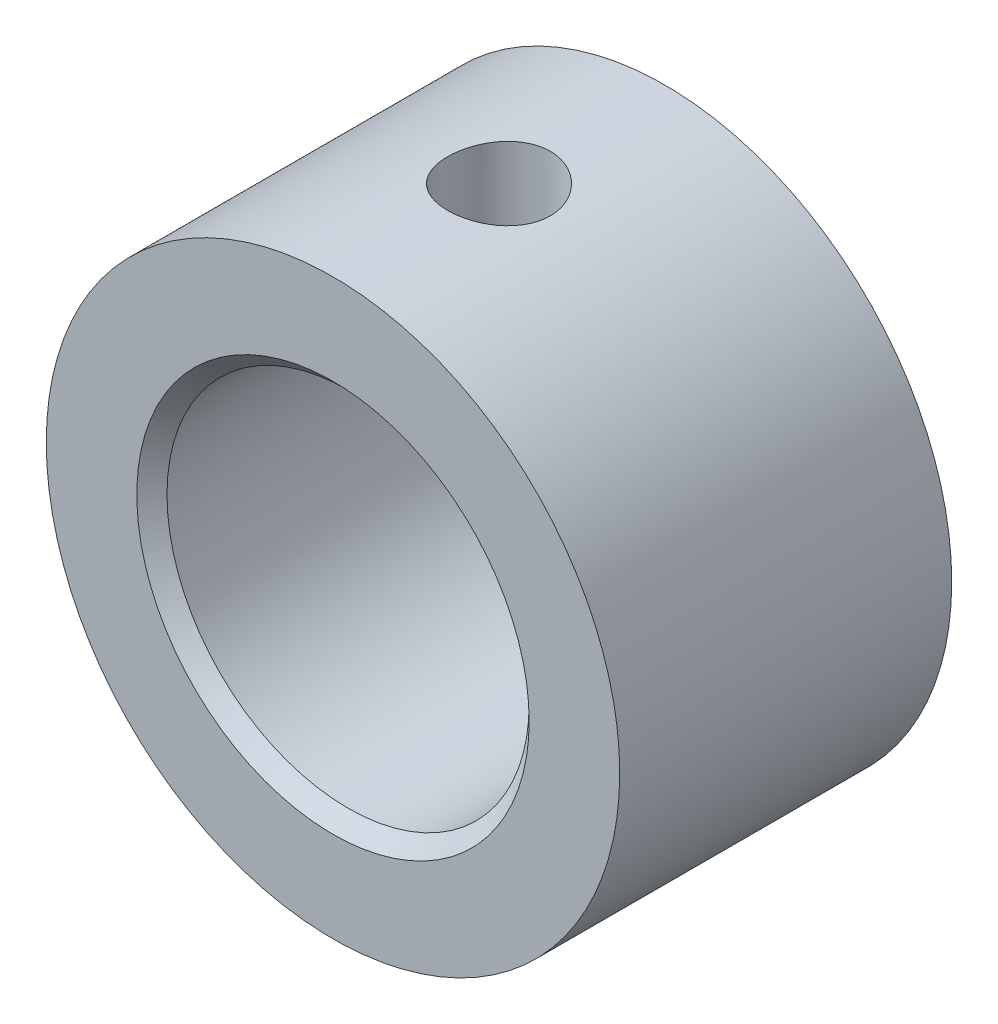
ISO-10303-21;
HEADER;
FILE_DESCRIPTION(('STEP AP214'),'2;1');
FILE_NAME('part.step','',(''),(''),'','','');
FILE_SCHEMA(('AUTOMOTIVE_DESIGN { 1 0 10303 214 1 1 1 1 }'));
ENDSEC;
DATA;
#1=APPLICATION_CONTEXT('core data for automotive mechanical design processes');
#2=APPLICATION_PROTOCOL_DEFINITION('international standard','automotive_design',2000,#1);
#3=PRODUCT_CONTEXT('',#1,'mechanical');
#4=PRODUCT('Part','Part','',(#3));
#5=PRODUCT_RELATED_PRODUCT_CATEGORY('part','',(#4));
#6=PRODUCT_DEFINITION_FORMATION('','',#4);
#7=PRODUCT_DEFINITION_CONTEXT('part definition',#1,'design');
#8=PRODUCT_DEFINITION('design','',#6,#7);
#9=PRODUCT_DEFINITION_SHAPE('','',#8);
#10=(LENGTH_UNIT() NAMED_UNIT(*) SI_UNIT(.MILLI.,.METRE.));
#11=(NAMED_UNIT(*) PLANE_ANGLE_UNIT() SI_UNIT($,.RADIAN.));
#12=(NAMED_UNIT(*) SI_UNIT($,.STERADIAN.) SOLID_ANGLE_UNIT());
#13=UNCERTAINTY_MEASURE_WITH_UNIT(LENGTH_MEASURE(1.E-05),#10,'distance_accuracy_value','');
#14=(GEOMETRIC_REPRESENTATION_CONTEXT(3) GLOBAL_UNCERTAINTY_ASSIGNED_CONTEXT((#13)) GLOBAL_UNIT_ASSIGNED_CONTEXT((#10,
#11,#12)) REPRESENTATION_CONTEXT('',''));
#15=CARTESIAN_POINT('',(0.,0.,0.));
#16=DIRECTION('',(0.,0.,1.));
#17=DIRECTION('',(1.,0.,0.));
#18=AXIS2_PLACEMENT_3D('',#15,#16,#17);
#19=CARTESIAN_POINT('',(0.,0.,11.));
#20=DIRECTION('',(0.,0.,1.));
#21=DIRECTION('',(1.,0.,0.));
#22=AXIS2_PLACEMENT_3D('',#19,#20,#21);
#23=PLANE('',#22);
#24=CARTESIAN_POINT('',(0.,0.,11.));
#25=DIRECTION('',(0.,0.,1.));
#26=DIRECTION('',(1.,0.,0.));
#27=AXIS2_PLACEMENT_3D('',#24,#25,#26);
#28=CIRCLE('',#27,13.);
#29=CARTESIAN_POINT('',(13.,0.,11.));
#30=VERTEX_POINT('',#29);
#31=EDGE_CURVE('E63',#30,#30,#28,.F.);
#32=ORIENTED_EDGE('',*,*,#31,.T.);
#33=EDGE_LOOP('',(#32));
#34=FACE_BOUND('',#33,.T.);
#35=CARTESIAN_POINT('',(0.,0.,11.));
#36=DIRECTION('',(0.,0.,1.));
#37=DIRECTION('',(1.,0.,0.));
#38=AXIS2_PLACEMENT_3D('',#35,#36,#37);
#39=CIRCLE('',#38,19.);
#40=CARTESIAN_POINT('',(19.,0.,11.));
#41=VERTEX_POINT('',#40);
#42=EDGE_CURVE('E83',#41,#41,#39,.T.);
#43=ORIENTED_EDGE('',*,*,#42,.T.);
#44=EDGE_LOOP('',(#43));
#45=FACE_BOUND('',#44,.T.);
#46=ADVANCED_FACE('F49',(#34,#45),#23,.T.);
#47=CARTESIAN_POINT('',(0.,0.,-11.));
#48=DIRECTION('',(0.,0.,1.));
#49=DIRECTION('',(1.,0.,0.));
#50=AXIS2_PLACEMENT_3D('',#47,#48,#49);
#51=PLANE('',#50);
#52=CARTESIAN_POINT('',(0.,0.,-11.));
#53=DIRECTION('',(0.,0.,1.));
#54=DIRECTION('',(1.,0.,0.));
#55=AXIS2_PLACEMENT_3D('',#52,#53,#54);
#56=CIRCLE('',#55,13.);
#57=CARTESIAN_POINT('',(13.,0.,-11.));
#58=VERTEX_POINT('',#57);
#59=EDGE_CURVE('E79',#58,#58,#56,.T.);
#60=ORIENTED_EDGE('',*,*,#59,.T.);
#61=EDGE_LOOP('',(#60));
#62=FACE_BOUND('',#61,.T.);
#63=CARTESIAN_POINT('',(0.,0.,-11.));
#64=DIRECTION('',(0.,0.,1.));
#65=DIRECTION('',(1.,0.,0.));
#66=AXIS2_PLACEMENT_3D('',#63,#64,#65);
#67=CIRCLE('',#66,19.);
#68=CARTESIAN_POINT('',(19.,0.,-11.));
#69=VERTEX_POINT('',#68);
#70=EDGE_CURVE('E84',#69,#69,#67,.T.);
#71=ORIENTED_EDGE('',*,*,#70,.F.);
#72=EDGE_LOOP('',(#71));
#73=FACE_BOUND('',#72,.T.);
#74=ADVANCED_FACE('F114',(#62,#73),#51,.F.);
#75=CARTESIAN_POINT('',(0.,0.,11.));
#76=DIRECTION('',(0.,0.,-1.));
#77=DIRECTION('',(-1.,0.,0.));
#78=AXIS2_PLACEMENT_3D('',#75,#76,#77);
#79=CYLINDRICAL_SURFACE('',#78,19.);
#80=CARTESIAN_POINT('',(0.,19.,-3.39999999999999));
#81=CARTESIAN_POINT('',(0.189359116148753,18.9999966349209,-3.39999260489716));
#82=CARTESIAN_POINT('',(0.378816292653439,18.99713985582,-3.38412733886621));
#83=CARTESIAN_POINT('',(0.752402493709805,18.9860188360453,-3.3211201690908));
#84=CARTESIAN_POINT('',(0.936526702895268,18.9777498582218,-3.27395086527263));
#85=CARTESIAN_POINT('',(1.29398914244799,18.9567304870848,-3.14981742951105));
#86=CARTESIAN_POINT('',(1.46733657564912,18.9439839809906,-3.07287913600945));
#87=CARTESIAN_POINT('',(1.79864358139372,18.9154055229009,-2.89146270633255));
#88=CARTESIAN_POINT('',(1.95660461419851,18.8995738641336,-2.78698718709902));
#89=CARTESIAN_POINT('',(2.25440369777336,18.8663818606133,-2.55224612642311));
#90=CARTESIAN_POINT('',(2.39404879462585,18.8490080449846,-2.42173767731485));
#91=CARTESIAN_POINT('',(2.64958378977429,18.8147911577378,-2.13915810684836));
#92=CARTESIAN_POINT('',(2.76547207227252,18.797948122286,-1.98708552001449));
#93=CARTESIAN_POINT('',(2.97099402925277,18.7665691484542,-1.66434686349449));
#94=CARTESIAN_POINT('',(3.06043372862367,18.7520505970165,-1.49355543055129));
#95=CARTESIAN_POINT('',(3.20927847227692,18.7271530893692,-1.13906853026264));
#96=CARTESIAN_POINT('',(3.26868586635062,18.7167738093077,-0.95537407375846));
#97=CARTESIAN_POINT('',(3.3551651248459,18.7014650301702,-0.582352232651503));
#98=CARTESIAN_POINT('',(3.38257209811783,18.6964790933344,-0.393104898969889));
#99=CARTESIAN_POINT('',(3.40531220803424,18.69235114719,-0.0126371955222291));
#100=CARTESIAN_POINT('',(3.40064796223401,18.6932086609569,0.17858301195192));
#101=CARTESIAN_POINT('',(3.35965028298723,18.7006192804987,0.555155821151376));
#102=CARTESIAN_POINT('',(3.32369593703935,18.7071042060553,0.740551233006275));
#103=CARTESIAN_POINT('',(3.22173478934299,18.7249320285173,1.10263530298788));
#104=CARTESIAN_POINT('',(3.15572681435812,18.7362751150751,1.27932362090778));
#105=CARTESIAN_POINT('',(2.99515565509624,18.7626134640921,1.62009803570002));
#106=CARTESIAN_POINT('',(2.90043756235276,18.7776284515749,1.7841095531177));
#107=CARTESIAN_POINT('',(2.68524459961301,18.8096054823071,2.09405428906096));
#108=CARTESIAN_POINT('',(2.56476734176921,18.8265677059959,2.23998582960949));
#109=CARTESIAN_POINT('',(2.29942291648305,18.8608261487862,2.51182017623147));
#110=CARTESIAN_POINT('',(2.15423106891539,18.8781236715029,2.63740610472903));
#111=CARTESIAN_POINT('',(1.8446702868463,18.9108798607181,2.8624837075214));
#112=CARTESIAN_POINT('',(1.6803011911899,18.9263385117616,2.9619751625099));
#113=CARTESIAN_POINT('',(1.33673505364186,18.9537023046531,3.13207868765565));
#114=CARTESIAN_POINT('',(1.15752241699952,18.9656036471012,3.20265990968225));
#115=CARTESIAN_POINT('',(0.789525108664181,18.9844820701314,3.31263025533811));
#116=CARTESIAN_POINT('',(0.600741363711164,18.9914596264956,3.35202239279308));
#117=CARTESIAN_POINT('',(0.221689022440056,18.9996395277903,3.39806019315269));
#118=CARTESIAN_POINT('',(0.0314747990638452,19.0009184998551,3.40514037678198));
#119=CARTESIAN_POINT('',(-0.347420440928694,18.9977680347034,3.38751583059651));
#120=CARTESIAN_POINT('',(-0.536101525527205,18.9933388520024,3.36281251794565));
#121=CARTESIAN_POINT('',(-0.905211583009181,18.9793173345974,3.28268356805853));
#122=CARTESIAN_POINT('',(-1.08568936212386,18.9697616265791,3.22747578861996));
#123=CARTESIAN_POINT('',(-1.43482762283372,18.9465540454197,3.08813931438424));
#124=CARTESIAN_POINT('',(-1.60348735836489,18.9329019139614,3.00400879569343));
#125=CARTESIAN_POINT('',(-1.92607037485075,18.9028249257681,2.80823911565088));
#126=CARTESIAN_POINT('',(-2.07982847751297,18.8863735762729,2.69633193020073));
#127=CARTESIAN_POINT('',(-2.36653881416634,18.852595910538,2.44855076121745));
#128=CARTESIAN_POINT('',(-2.49948928804732,18.8352695204427,2.31267475223546));
#129=CARTESIAN_POINT('',(-2.74244444474001,18.8014430595408,2.01885336372394));
#130=CARTESIAN_POINT('',(-2.85215381250747,18.78495543858,1.86066212754368));
#131=CARTESIAN_POINT('',(-3.04344209969357,18.7549160166177,1.52784032049266));
#132=CARTESIAN_POINT('',(-3.12502200376045,18.7413641128602,1.35321032531928));
#133=CARTESIAN_POINT('',(-3.25730709364541,18.7188264245687,0.993250009811813));
#134=CARTESIAN_POINT('',(-3.30815255943243,18.7098199252254,0.807972598993068));
#135=CARTESIAN_POINT('',(-3.37796206615852,18.6973434437131,0.431330114277985));
#136=CARTESIAN_POINT('',(-3.39692934938192,18.6938728984918,0.239965661503487));
#137=CARTESIAN_POINT('',(-3.40234319134434,18.6928880346328,-0.140464751160433));
#138=CARTESIAN_POINT('',(-3.38925512617539,18.6952884808671,-0.329524026264392));
#139=CARTESIAN_POINT('',(-3.3319433273961,18.7055870627166,-0.702702377064291));
#140=CARTESIAN_POINT('',(-3.28771974175138,18.7134851722051,-0.886821476233157));
#141=CARTESIAN_POINT('',(-3.16958106311172,18.7338547388841,-1.24467245641459));
#142=CARTESIAN_POINT('',(-3.09571200330978,18.746319103037,-1.41841996403912));
#143=CARTESIAN_POINT('',(-2.92042873118774,18.7744225034866,-1.75113058193775));
#144=CARTESIAN_POINT('',(-2.8190128153699,18.7900617361021,-1.91009277707165));
#145=CARTESIAN_POINT('',(-2.58987842643081,18.8230197247812,-2.21106023020039));
#146=CARTESIAN_POINT('',(-2.46181965856844,18.8403585009623,-2.35280426215342));
#147=CARTESIAN_POINT('',(-2.1837480840731,18.8746080286539,-2.61294848534312));
#148=CARTESIAN_POINT('',(-2.03373023484455,18.8915186808027,-2.73134330006126));
#149=CARTESIAN_POINT('',(-1.71454851307093,18.9231663993433,-2.94231591812969));
#150=CARTESIAN_POINT('',(-1.54523951687639,18.9378847672342,-3.03467702903229));
#151=CARTESIAN_POINT('',(-1.19330528614379,18.9633074648247,-3.1894994199818));
#152=CARTESIAN_POINT('',(-1.01069307810336,18.9740156598171,-3.25198950801308));
#153=CARTESIAN_POINT('',(-0.68955673562887,18.9879627193211,-3.33223394210692));
#154=CARTESIAN_POINT('',(-0.552939078666318,18.992451791999,-3.35760395909225));
#155=CARTESIAN_POINT('',(-0.277565147922436,18.998471633606,-3.39148951556511));
#156=CARTESIAN_POINT('',(-0.13880892063465,19.0000024667574,-3.40000542094968));
#157=CARTESIAN_POINT('',(0.,19.,-3.39999999999999));
#158=B_SPLINE_CURVE_WITH_KNOTS('',3,(#80,#81,#82,#83,#84,#85,#86,#87,#88,#89,#90,#91,#92,#93,
#94,#95,#96,#97,#98,#99,#100,#101,#102,#103,#104,#105,#106,#107,#108,#109,#110,#111,#112,#113,
#114,#115,#116,#117,#118,#119,#120,#121,#122,#123,#124,#125,#126,#127,#128,#129,#130,#131,#132,
#133,#134,#135,#136,#137,#138,#139,#140,#141,#142,#143,#144,#145,#146,#147,#148,#149,#150,#151,
#152,#153,#154,#155,#156,#157),.UNSPECIFIED.,.T.,.F.,(4,2,2,2,2,2,2,2,2,2,2,2,2,2,2,2,2,2,2,2,2,
2,2,2,2,2,2,2,2,2,2,2,2,2,2,2,2,2,4),(0.,0.567569821708364,1.13563708729388,1.70321239244777,
2.27073377872327,2.84382163815749,3.41694846270903,3.99417992316398,4.57136621281048,
5.1424523938897,5.71349196520635,6.27770806931201,6.84194620122778,7.4092846332032,
7.97667567967407,8.55219507118144,9.12771929938311,9.70385604029427,10.2799371018632,
10.8482479323349,11.4165334238169,11.9808118150049,12.5451257966195,13.1151124371865,
13.6851472666984,14.2620404102666,14.8389133581249,15.4131330256255,15.9872942865302,
16.5531694756567,17.1190419755876,17.6840391733022,18.2490713184047,18.8218200155169,
19.3947004432856,19.9722172111757,20.5491758853879,20.9652396396078,21.3812943611256),.UNSPECIFIED.);
#159=CARTESIAN_POINT('',(0.,19.,-3.39999999999999));
#160=VERTEX_POINT('',#159);
#161=EDGE_CURVE('E10',#160,#160,#158,.T.);
#162=ORIENTED_EDGE('',*,*,#161,.T.);
#163=EDGE_LOOP('',(#162));
#164=FACE_BOUND('',#163,.T.);
#165=ORIENTED_EDGE('',*,*,#42,.F.);
#166=EDGE_LOOP('',(#165));
#167=FACE_BOUND('',#166,.T.);
#168=ORIENTED_EDGE('',*,*,#70,.T.);
#169=EDGE_LOOP('',(#168));
#170=FACE_BOUND('',#169,.T.);
#171=ADVANCED_FACE('F118',(#164,#167,#170),#79,.T.);
#172=CARTESIAN_POINT('',(0.,0.,11.));
#173=DIRECTION('',(0.,0.,-1.));
#174=DIRECTION('',(-1.,0.,0.));
#175=AXIS2_PLACEMENT_3D('',#172,#173,#174);
#176=CYLINDRICAL_SURFACE('',#175,12.);
#177=CARTESIAN_POINT('',(0.,12.,-3.39999999999999));
#178=CARTESIAN_POINT('',(0.186988723006802,11.9999976894995,-3.39999654515311));
#179=CARTESIAN_POINT('',(0.374013129044811,11.9955869790957,-3.38452289452517));
#180=CARTESIAN_POINT('',(0.742645539803736,11.978421310291,-3.32316474263533));
#181=CARTESIAN_POINT('',(0.924251394649756,11.9656630847614,-3.27726833413674));
#182=CARTESIAN_POINT('',(1.27667451033523,11.9332056155741,-3.15669818854128));
#183=CARTESIAN_POINT('',(1.44750629175166,11.9135159600134,-3.08206419022341));
#184=CARTESIAN_POINT('',(1.77422996762131,11.8692596451322,-2.90629246901087));
#185=CARTESIAN_POINT('',(1.93012036783267,11.8446924987819,-2.80515209906423));
#186=CARTESIAN_POINT('',(2.2265727408465,11.7926067463956,-2.57647599407728));
#187=CARTESIAN_POINT('',(2.36669287477965,11.7650327041957,-2.44838010217978));
#188=CARTESIAN_POINT('',(2.62377746294635,11.710384349036,-2.17062474848013));
#189=CARTESIAN_POINT('',(2.74073851104081,11.6833101101154,-2.02096212031917));
#190=CARTESIAN_POINT('',(2.9504214791365,11.6321505087001,-1.70069227595643));
#191=CARTESIAN_POINT('',(3.04262008737009,11.6081345918898,-1.52973032035533));
#192=CARTESIAN_POINT('',(3.19678447976278,11.5666325199825,-1.17393952935456));
#193=CARTESIAN_POINT('',(3.25875664675473,11.5491449864884,-0.989113631084229));
#194=CARTESIAN_POINT('',(3.3491458454404,11.523254649818,-0.615769196133596));
#195=CARTESIAN_POINT('',(3.3783706746558,11.5146335954139,-0.427461754396682));
#196=CARTESIAN_POINT('',(3.40495614059056,11.5068015751047,-0.0484345834704532));
#197=CARTESIAN_POINT('',(3.40232357417,11.5075886019598,0.142284622488662));
#198=CARTESIAN_POINT('',(3.3659069468269,11.5182894019548,0.514290642327089));
#199=CARTESIAN_POINT('',(3.33311680165041,11.5279119623157,0.695684488524945));
#200=CARTESIAN_POINT('',(3.23891447064178,11.5547309762144,1.05028371210905));
#201=CARTESIAN_POINT('',(3.17749973577107,11.571928104265,1.22348835872839));
#202=CARTESIAN_POINT('',(3.02702000247794,11.6122029970937,1.55930523930796));
#203=CARTESIAN_POINT('',(2.93761936103543,11.6353515015401,1.7217582272462));
#204=CARTESIAN_POINT('',(2.73393923873161,11.6848848404208,2.02969789754663));
#205=CARTESIAN_POINT('',(2.61965430037688,11.7112703842306,2.17518084736347));
#206=CARTESIAN_POINT('',(2.3644384880438,11.7655019418414,2.45070988855651));
#207=CARTESIAN_POINT('',(2.22267761473758,11.7933658561595,2.57998484905875));
#208=CARTESIAN_POINT('',(1.91914394226504,11.8465434962535,2.8130953645113));
#209=CARTESIAN_POINT('',(1.75737014055516,11.8718570941566,2.91692964423866));
#210=CARTESIAN_POINT('',(1.41710818718241,11.9172725195752,3.09661243148349));
#211=CARTESIAN_POINT('',(1.23853415181858,11.9373453394433,3.17230611971877));
#212=CARTESIAN_POINT('',(0.870493313262321,11.9698084682665,3.29236735714387));
#213=CARTESIAN_POINT('',(0.681029221017462,11.9822006802423,3.33674266645245));
#214=CARTESIAN_POINT('',(0.303154957557575,11.9976120721705,3.3916613378015));
#215=CARTESIAN_POINT('',(0.11490850759277,12.0009211466434,3.40325144365154));
#216=CARTESIAN_POINT('',(-0.260843954691256,11.9986351585894,3.3951824088832));
#217=CARTESIAN_POINT('',(-0.44835005164439,11.9930411452132,3.37552695028075));
#218=CARTESIAN_POINT('',(-0.813458754633998,11.9737661190198,3.30637784818576));
#219=CARTESIAN_POINT('',(-0.991183847873728,11.9602471142118,3.25748157277704));
#220=CARTESIAN_POINT('',(-1.33588137868177,11.9266691254866,3.13194464825207));
#221=CARTESIAN_POINT('',(-1.50285257915344,11.9066093907463,3.05530081382802));
#222=CARTESIAN_POINT('',(-1.82526541940406,11.861513032548,2.87459345422479));
#223=CARTESIAN_POINT('',(-1.98038396117499,11.83637911244,2.76997837766903));
#224=CARTESIAN_POINT('',(-2.27122670910133,11.7840316953508,2.53697995220911));
#225=CARTESIAN_POINT('',(-2.40694656533513,11.7568177340385,2.40859128713356));
#226=CARTESIAN_POINT('',(-2.65964886059324,11.7022877337646,2.12678587594579));
#227=CARTESIAN_POINT('',(-2.77588926106478,11.6749965028313,1.97269758105401));
#228=CARTESIAN_POINT('',(-2.98089638568579,11.6243472438701,1.64661437260529));
#229=CARTESIAN_POINT('',(-3.06966409668132,11.6009890745766,1.47462010254526));
#230=CARTESIAN_POINT('',(-3.21655436429692,11.5611234633149,1.11834320124708));
#231=CARTESIAN_POINT('',(-3.27484185410173,11.5445792556114,0.934132914563011));
#232=CARTESIAN_POINT('',(-3.35943564927296,11.5202502903812,0.557966955519683));
#233=CARTESIAN_POINT('',(-3.38575144497171,11.5124629335619,0.366013599066607));
#234=CARTESIAN_POINT('',(-3.40505903433642,11.5067658536042,-0.0125400295424057));
#235=CARTESIAN_POINT('',(-3.39925135680483,11.5085002614852,-0.19907457281664));
#236=CARTESIAN_POINT('',(-3.35730104081666,11.5208071466602,-0.568388584805974));
#237=CARTESIAN_POINT('',(-3.32115938334995,11.5313793381435,-0.751168174759067));
#238=CARTESIAN_POINT('',(-3.22030290963228,11.559945267114,-1.10605398203868));
#239=CARTESIAN_POINT('',(-3.15587336042932,11.5778647945951,-1.27824767437689));
#240=CARTESIAN_POINT('',(-3.00049062929936,11.6191001457546,-1.60951658729846));
#241=CARTESIAN_POINT('',(-2.90953281859188,11.6424169110228,-1.76858951228735));
#242=CARTESIAN_POINT('',(-2.70016758301965,11.6927769260713,-2.0747550386308));
#243=CARTESIAN_POINT('',(-2.58095587117125,11.7199175029704,-2.22128167292427));
#244=CARTESIAN_POINT('',(-2.3199563951487,11.7743596500437,-2.49264015103588));
#245=CARTESIAN_POINT('',(-2.178162981249,11.8016612588561,-2.61746654927272));
#246=CARTESIAN_POINT('',(-1.87173543340637,11.854169649701,-2.84498206471172));
#247=CARTESIAN_POINT('',(-1.70661747952893,11.879306684542,-2.94703716679717));
#248=CARTESIAN_POINT('',(-1.36085616772711,11.9238570871221,-3.12178524514181));
#249=CARTESIAN_POINT('',(-1.18022155618585,11.9432736523681,-3.19449463288671));
#250=CARTESIAN_POINT('',(-0.833896806677213,11.9720761539671,-3.30042776515168));
#251=CARTESIAN_POINT('',(-0.669510205593753,11.9824664269937,-3.33767381936305));
#252=CARTESIAN_POINT('',(-0.336758372296811,11.9964289510843,-3.38745990058828));
#253=CARTESIAN_POINT('',(-0.16839365560971,12.0000020807331,-3.40000311128011));
#254=CARTESIAN_POINT('',(0.,12.,-3.39999999999999));
#255=B_SPLINE_CURVE_WITH_KNOTS('',3,(#177,#178,#179,#180,#181,#182,#183,#184,#185,#186,#187,
#188,#189,#190,#191,#192,#193,#194,#195,#196,#197,#198,#199,#200,#201,#202,#203,#204,#205,#206,
#207,#208,#209,#210,#211,#212,#213,#214,#215,#216,#217,#218,#219,#220,#221,#222,#223,#224,#225,
#226,#227,#228,#229,#230,#231,#232,#233,#234,#235,#236,#237,#238,#239,#240,#241,#242,#243,#244,
#245,#246,#247,#248,#249,#250,#251,#252,#253,#254),.UNSPECIFIED.,.T.,.F.,(4,2,2,2,2,2,2,2,2,2,2,
2,2,2,2,2,2,2,2,2,2,2,2,2,2,2,2,2,2,2,2,2,2,2,2,2,2,2,4),(0.,0.560348142204922,1.12091573002295,
1.6807109242009,2.24056204349824,2.81345906099406,3.38644027524374,3.97071735325471,
4.55487099763862,5.12427396600803,5.69355545288188,6.24472222680333,6.79593809186946,
7.35403594009777,7.91225631092403,8.4911478960936,9.07006849247082,9.65212855107145,
10.2340443352033,10.7971591987439,11.3602077090519,11.9121287085317,12.4641130864157,
13.0279069529174,13.5918270457282,14.1738637700682,14.7558795846485,15.3347125533409,
15.9133736618742,16.4705585180481,17.0277253557606,17.5793981094271,18.1311671792932,
18.7010804119392,19.2711364560676,19.8554954373023,20.4395271635271,20.9442166112637,
21.4488410108675),.UNSPECIFIED.);
#256=CARTESIAN_POINT('',(0.,12.,-3.39999999999999));
#257=VERTEX_POINT('',#256);
#258=EDGE_CURVE('E88',#257,#257,#255,.T.);
#259=ORIENTED_EDGE('',*,*,#258,.F.);
#260=EDGE_LOOP('',(#259));
#261=FACE_BOUND('',#260,.T.);
#262=CARTESIAN_POINT('',(0.,0.,-10.));
#263=DIRECTION('',(0.,0.,1.));
#264=DIRECTION('',(1.,0.,0.));
#265=AXIS2_PLACEMENT_3D('',#262,#263,#264);
#266=CIRCLE('',#265,12.);
#267=CARTESIAN_POINT('',(12.,0.,-10.));
#268=VERTEX_POINT('',#267);
#269=EDGE_CURVE('E68',#268,#268,#266,.F.);
#270=ORIENTED_EDGE('',*,*,#269,.T.);
#271=EDGE_LOOP('',(#270));
#272=FACE_BOUND('',#271,.T.);
#273=CARTESIAN_POINT('',(0.,0.,10.));
#274=DIRECTION('',(0.,0.,1.));
#275=DIRECTION('',(1.,0.,0.));
#276=AXIS2_PLACEMENT_3D('',#273,#274,#275);
#277=CIRCLE('',#276,12.);
#278=CARTESIAN_POINT('',(12.,0.,10.));
#279=VERTEX_POINT('',#278);
#280=EDGE_CURVE('E73',#279,#279,#277,.T.);
#281=ORIENTED_EDGE('',*,*,#280,.T.);
#282=EDGE_LOOP('',(#281));
#283=FACE_BOUND('',#282,.T.);
#284=ADVANCED_FACE('F98',(#261,#272,#283),#176,.F.);
#285=CARTESIAN_POINT('',(0.,0.,-11.));
#286=DIRECTION('',(0.,0.,-1.));
#287=DIRECTION('',(-1.,0.,0.));
#288=AXIS2_PLACEMENT_3D('',#285,#286,#287);
#289=CONICAL_SURFACE('',#288,13.,0.785398163397446);
#290=ORIENTED_EDGE('',*,*,#269,.F.);
#291=EDGE_LOOP('',(#290));
#292=FACE_BOUND('',#291,.T.);
#293=ORIENTED_EDGE('',*,*,#59,.F.);
#294=EDGE_LOOP('',(#293));
#295=FACE_BOUND('',#294,.T.);
#296=ADVANCED_FACE('F110',(#292,#295),#289,.F.);
#297=CARTESIAN_POINT('',(0.,0.,10.));
#298=DIRECTION('',(0.,0.,1.));
#299=DIRECTION('',(1.,0.,0.));
#300=AXIS2_PLACEMENT_3D('',#297,#298,#299);
#301=CONICAL_SURFACE('',#300,12.,0.785398163397448);
#302=ORIENTED_EDGE('',*,*,#31,.F.);
#303=EDGE_LOOP('',(#302));
#304=FACE_BOUND('',#303,.T.);
#305=ORIENTED_EDGE('',*,*,#280,.F.);
#306=EDGE_LOOP('',(#305));
#307=FACE_BOUND('',#306,.T.);
#308=ADVANCED_FACE('F52',(#304,#307),#301,.F.);
#309=CARTESIAN_POINT('',(0.,0.,0.));
#310=DIRECTION('',(0.,-1.,0.));
#311=DIRECTION('',(0.,0.,-1.));
#312=AXIS2_PLACEMENT_3D('',#309,#310,#311);
#313=CYLINDRICAL_SURFACE('',#312,3.39999999999999);
#314=ORIENTED_EDGE('',*,*,#258,.T.);
#315=EDGE_LOOP('',(#314));
#316=FACE_BOUND('',#315,.T.);
#317=ORIENTED_EDGE('',*,*,#161,.F.);
#318=EDGE_LOOP('',(#317));
#319=FACE_BOUND('',#318,.T.);
#320=ADVANCED_FACE('F101',(#316,#319),#313,.F.);
#321=CLOSED_SHELL('',(#46,#74,#171,#284,#296,#308,#320));
#322=MANIFOLD_SOLID_BREP('B2',#321);
#323=ADVANCED_BREP_SHAPE_REPRESENTATION('',(#18,#322),#14);
#324=SHAPE_DEFINITION_REPRESENTATION(#9,#323);
ENDSEC;
END-ISO-10303-21;
